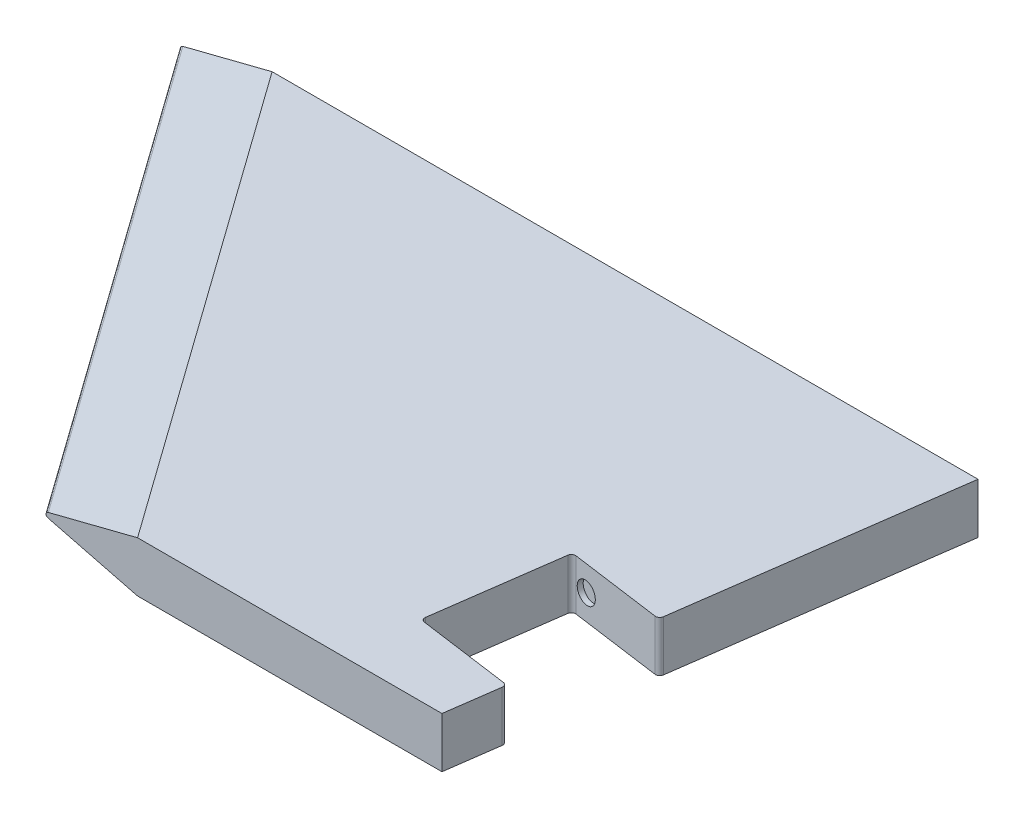
ISO-10303-21;
HEADER;
FILE_DESCRIPTION(('STEP AP214'),'2;1');
FILE_NAME('part.step','',(''),(''),'','','');
FILE_SCHEMA(('AUTOMOTIVE_DESIGN { 1 0 10303 214 1 1 1 1 }'));
ENDSEC;
DATA;
#1=APPLICATION_CONTEXT('core data for automotive mechanical design processes');
#2=APPLICATION_PROTOCOL_DEFINITION('international standard','automotive_design',2000,#1);
#3=PRODUCT_CONTEXT('',#1,'mechanical');
#4=PRODUCT('Part','Part','',(#3));
#5=PRODUCT_RELATED_PRODUCT_CATEGORY('part','',(#4));
#6=PRODUCT_DEFINITION_FORMATION('','',#4);
#7=PRODUCT_DEFINITION_CONTEXT('part definition',#1,'design');
#8=PRODUCT_DEFINITION('design','',#6,#7);
#9=PRODUCT_DEFINITION_SHAPE('','',#8);
#10=(LENGTH_UNIT() NAMED_UNIT(*) SI_UNIT(.MILLI.,.METRE.));
#11=(NAMED_UNIT(*) PLANE_ANGLE_UNIT() SI_UNIT($,.RADIAN.));
#12=(NAMED_UNIT(*) SI_UNIT($,.STERADIAN.) SOLID_ANGLE_UNIT());
#13=UNCERTAINTY_MEASURE_WITH_UNIT(LENGTH_MEASURE(1.E-05),#10,'distance_accuracy_value','');
#14=(GEOMETRIC_REPRESENTATION_CONTEXT(3) GLOBAL_UNCERTAINTY_ASSIGNED_CONTEXT((#13)) GLOBAL_UNIT_ASSIGNED_CONTEXT((#10,
#11,#12)) REPRESENTATION_CONTEXT('',''));
#15=CARTESIAN_POINT('',(0.,0.,0.));
#16=DIRECTION('',(0.,0.,1.));
#17=DIRECTION('',(1.,0.,0.));
#18=AXIS2_PLACEMENT_3D('',#15,#16,#17);
#19=CARTESIAN_POINT('',(0.,9.525,0.));
#20=DIRECTION('',(0.,1.,0.));
#21=DIRECTION('',(0.,0.,1.));
#22=AXIS2_PLACEMENT_3D('',#19,#20,#21);
#23=PLANE('',#22);
#24=DIRECTION('',(-1.,0.,0.));
#25=VECTOR('',#24,1.);
#26=CARTESIAN_POINT('',(-44.1989637892254,9.525,-122.50361009361));
#27=LINE('',#26,#25);
#28=CARTESIAN_POINT('',(107.801036210774,9.525,-122.50361009361));
#29=VERTEX_POINT('',#28);
#30=CARTESIAN_POINT('',(-25.4640970271406,9.525,-122.50361009361));
#31=VERTEX_POINT('',#30);
#32=EDGE_CURVE('E153',#29,#31,#27,.T.);
#33=ORIENTED_EDGE('',*,*,#32,.T.);
#34=DIRECTION('',(-0.581238193719096,0.,-0.813733471206735));
#35=VECTOR('',#34,1.);
#36=CARTESIAN_POINT('',(67.9353624323188,9.525,8.25563314963355));
#37=LINE('',#36,#35);
#38=CARTESIAN_POINT('',(38.0359029728593,9.525,-33.6036100936097));
#39=VERTEX_POINT('',#38);
#40=EDGE_CURVE('E155',#39,#31,#37,.T.);
#41=ORIENTED_EDGE('',*,*,#40,.F.);
#42=DIRECTION('',(1.,0.,0.));
#43=VECTOR('',#42,1.);
#44=CARTESIAN_POINT('',(19.3010362107745,9.525,-33.6036100936097));
#45=LINE('',#44,#43);
#46=CARTESIAN_POINT('',(95.5010362107745,9.525,-33.6036100936097));
#47=VERTEX_POINT('',#46);
#48=EDGE_CURVE('E164',#39,#47,#45,.T.);
#49=ORIENTED_EDGE('',*,*,#48,.T.);
#50=DIRECTION('',(0.137052139146914,0.,-0.990563834972413));
#51=VECTOR('',#50,1.);
#52=CARTESIAN_POINT('',(95.5010362107745,9.525,-33.6036100936097));
#53=LINE('',#52,#51);
#54=CARTESIAN_POINT('',(96.8828312372264,9.525,-43.5907302441439));
#55=VERTEX_POINT('',#54);
#56=EDGE_CURVE('E199',#47,#55,#53,.T.);
#57=ORIENTED_EDGE('',*,*,#56,.T.);
#58=CARTESIAN_POINT('',(96.096571193217,9.525,-43.6995153795918));
#59=DIRECTION('',(0.,1.,0.));
#60=DIRECTION('',(0.,0.,1.));
#61=AXIS2_PLACEMENT_3D('',#58,#59,#60);
#62=CIRCLE('',#61,0.79375);
#63=CARTESIAN_POINT('',(96.2053563286649,9.525,-44.4857754236011));
#64=VERTEX_POINT('',#63);
#65=EDGE_CURVE('E234',#55,#64,#62,.T.);
#66=ORIENTED_EDGE('',*,*,#65,.T.);
#67=DIRECTION('',(0.990563834972414,0.,0.137052139146913));
#68=VECTOR('',#67,1.);
#69=CARTESIAN_POINT('',(96.9916163726742,9.525,-44.3769902881533));
#70=LINE('',#69,#68);
#71=CARTESIAN_POINT('',(78.9076353604591,9.525,-46.8790484034541));
#72=VERTEX_POINT('',#71);
#73=EDGE_CURVE('E307',#72,#64,#70,.T.);
#74=ORIENTED_EDGE('',*,*,#73,.F.);
#75=CARTESIAN_POINT('',(79.016420495907,9.525,-47.6653084474635));
#76=DIRECTION('',(0.,1.,0.));
#77=DIRECTION('',(0.,0.,1.));
#78=AXIS2_PLACEMENT_3D('',#75,#76,#77);
#79=CIRCLE('',#78,0.79375);
#80=CARTESIAN_POINT('',(78.2301604518976,9.525,-47.7740935829113));
#81=VERTEX_POINT('',#80);
#82=EDGE_CURVE('E265',#72,#81,#79,.F.);
#83=ORIENTED_EDGE('',*,*,#82,.T.);
#84=DIRECTION('',(-0.137052139146914,0.,0.990563834972414));
#85=VECTOR('',#84,1.);
#86=CARTESIAN_POINT('',(81.6024996507814,9.525,-72.1481549472013));
#87=LINE('',#86,#85);
#88=CARTESIAN_POINT('',(81.4937145153335,9.525,-71.3618949031919));
#89=VERTEX_POINT('',#88);
#90=EDGE_CURVE('E281',#89,#81,#87,.T.);
#91=ORIENTED_EDGE('',*,*,#90,.F.);
#92=CARTESIAN_POINT('',(82.2799745593429,9.525,-71.2531097677441));
#93=DIRECTION('',(0.,1.,0.));
#94=DIRECTION('',(0.,0.,1.));
#95=AXIS2_PLACEMENT_3D('',#92,#93,#94);
#96=CIRCLE('',#95,0.79375);
#97=CARTESIAN_POINT('',(82.3887596947907,9.525,-72.0393698117534));
#98=VERTEX_POINT('',#97);
#99=EDGE_CURVE('E68',#89,#98,#96,.F.);
#100=ORIENTED_EDGE('',*,*,#99,.T.);
#101=DIRECTION('',(-0.990563834972414,0.,-0.137052139146914));
#102=VECTOR('',#101,1.);
#103=CARTESIAN_POINT('',(81.6024996507814,9.525,-72.1481549472013));
#104=LINE('',#103,#102);
#105=CARTESIAN_POINT('',(99.6864806629965,9.525,-69.6460968319004));
#106=VERTEX_POINT('',#105);
#107=EDGE_CURVE('E314',#106,#98,#104,.T.);
#108=ORIENTED_EDGE('',*,*,#107,.F.);
#109=CARTESIAN_POINT('',(99.7952657984444,9.525,-70.4323568759098));
#110=DIRECTION('',(0.,1.,0.));
#111=DIRECTION('',(0.,0.,1.));
#112=AXIS2_PLACEMENT_3D('',#109,#110,#111);
#113=CIRCLE('',#112,0.79375);
#114=CARTESIAN_POINT('',(100.581525842454,9.525,-70.3235717404619));
#115=VERTEX_POINT('',#114);
#116=EDGE_CURVE('E237',#106,#115,#113,.T.);
#117=ORIENTED_EDGE('',*,*,#116,.T.);
#118=EDGE_CURVE('E158',#115,#29,#53,.T.);
#119=ORIENTED_EDGE('',*,*,#118,.T.);
#120=EDGE_LOOP('',(#33,#41,#49,#57,#66,#74,#83,#91,#100,#108,#117,#119));
#121=FACE_BOUND('',#120,.T.);
#122=ADVANCED_FACE('F52',(#121),#23,.T.);
#123=CARTESIAN_POINT('',(95.5010362107745,9.525,-33.6036100936097));
#124=DIRECTION('',(-0.990563834972414,0.,-0.137052139146914));
#125=DIRECTION('',(-0.137052139146914,0.,0.990563834972414));
#126=AXIS2_PLACEMENT_3D('',#123,#124,#125);
#127=PLANE('',#126);
#128=DIRECTION('',(0.137052139146914,0.,-0.990563834972413));
#129=VECTOR('',#128,1.);
#130=CARTESIAN_POINT('',(95.5010362107745,0.,-33.6036100936097));
#131=LINE('',#130,#129);
#132=CARTESIAN_POINT('',(95.5010362107745,0.,-33.6036100936097));
#133=VERTEX_POINT('',#132);
#134=CARTESIAN_POINT('',(96.8828312372264,0.,-43.5907302441439));
#135=VERTEX_POINT('',#134);
#136=EDGE_CURVE('E165',#133,#135,#131,.T.);
#137=ORIENTED_EDGE('',*,*,#136,.T.);
#138=DIRECTION('',(0.,1.,0.));
#139=VECTOR('',#138,1.);
#140=CARTESIAN_POINT('',(96.8828312372264,9.525,-43.5907302441439));
#141=LINE('',#140,#139);
#142=EDGE_CURVE('E249',#135,#55,#141,.T.);
#143=ORIENTED_EDGE('',*,*,#142,.T.);
#144=ORIENTED_EDGE('',*,*,#56,.F.);
#145=DIRECTION('',(0.,-1.,0.));
#146=VECTOR('',#145,1.);
#147=CARTESIAN_POINT('',(95.5010362107745,9.525,-33.6036100936097));
#148=LINE('',#147,#146);
#149=EDGE_CURVE('E216',#47,#133,#148,.T.);
#150=ORIENTED_EDGE('',*,*,#149,.T.);
#151=EDGE_LOOP('',(#137,#143,#144,#150));
#152=FACE_BOUND('',#151,.T.);
#153=ADVANCED_FACE('F365',(#152),#127,.F.);
#154=CARTESIAN_POINT('',(-44.1989637892254,9.525,-122.50361009361));
#155=DIRECTION('',(0.,0.,1.));
#156=DIRECTION('',(1.,0.,0.));
#157=AXIS2_PLACEMENT_3D('',#154,#155,#156);
#158=PLANE('',#157);
#159=DIRECTION('',(0.969175963988059,-0.246369541193338,0.));
#160=VECTOR('',#159,1.);
#161=CARTESIAN_POINT('',(-44.1989637892254,4.7625,-122.50361009361));
#162=LINE('',#161,#160);
#163=CARTESIAN_POINT('',(-42.3215258296371,4.28524556333464,-122.50361009361));
#164=VERTEX_POINT('',#163);
#165=CARTESIAN_POINT('',(-25.4640970271406,0.,-122.50361009361));
#166=VERTEX_POINT('',#165);
#167=EDGE_CURVE('E171',#164,#166,#162,.T.);
#168=ORIENTED_EDGE('',*,*,#167,.F.);
#169=CARTESIAN_POINT('',(-42.1383070467038,4.7625,-122.50361009361));
#170=DIRECTION('',(0.,0.,1.));
#171=DIRECTION('',(-1.,0.,0.));
#172=AXIS2_PLACEMENT_3D('',#169,#170,#171);
#173=ELLIPSE('',#172,0.614451804788759,0.5);
#174=CARTESIAN_POINT('',(-42.3215258296371,5.23975443666536,-122.50361009361));
#175=VERTEX_POINT('',#174);
#176=EDGE_CURVE('E175',#164,#175,#173,.F.);
#177=ORIENTED_EDGE('',*,*,#176,.T.);
#178=DIRECTION('',(-0.969175963988059,-0.246369541193337,0.));
#179=VECTOR('',#178,1.);
#180=CARTESIAN_POINT('',(-44.1989637892254,4.7625,-122.50361009361));
#181=LINE('',#180,#179);
#182=EDGE_CURVE('E168',#31,#175,#181,.T.);
#183=ORIENTED_EDGE('',*,*,#182,.F.);
#184=ORIENTED_EDGE('',*,*,#32,.F.);
#185=DIRECTION('',(0.,-1.,0.));
#186=VECTOR('',#185,1.);
#187=CARTESIAN_POINT('',(107.801036210774,9.525,-122.50361009361));
#188=LINE('',#187,#186);
#189=CARTESIAN_POINT('',(107.801036210774,0.,-122.50361009361));
#190=VERTEX_POINT('',#189);
#191=EDGE_CURVE('E203',#29,#190,#188,.T.);
#192=ORIENTED_EDGE('',*,*,#191,.T.);
#193=DIRECTION('',(-1.,0.,0.));
#194=VECTOR('',#193,1.);
#195=CARTESIAN_POINT('',(-44.1989637892254,0.,-122.50361009361));
#196=LINE('',#195,#194);
#197=EDGE_CURVE('E195',#190,#166,#196,.T.);
#198=ORIENTED_EDGE('',*,*,#197,.T.);
#199=EDGE_LOOP('',(#168,#177,#183,#184,#192,#198));
#200=FACE_BOUND('',#199,.T.);
#201=ADVANCED_FACE('F174',(#200),#158,.F.);
#202=CARTESIAN_POINT('',(19.3010362107745,9.525,-33.6036100936097));
#203=DIRECTION('',(0.,0.,-1.));
#204=DIRECTION('',(-1.,0.,0.));
#205=AXIS2_PLACEMENT_3D('',#202,#203,#204);
#206=PLANE('',#205);
#207=DIRECTION('',(0.969175963988059,0.246369541193337,0.));
#208=VECTOR('',#207,1.);
#209=CARTESIAN_POINT('',(47.3856597501854,11.901756515938,-33.6036100936097));
#210=LINE('',#209,#208);
#211=CARTESIAN_POINT('',(21.1784741703629,5.23975443666536,-33.6036100936097));
#212=VERTEX_POINT('',#211);
#213=EDGE_CURVE('E169',#212,#39,#210,.T.);
#214=ORIENTED_EDGE('',*,*,#213,.F.);
#215=CARTESIAN_POINT('',(21.3616929532962,4.7625,-33.6036100936097));
#216=DIRECTION('',(0.,0.,-1.));
#217=DIRECTION('',(-1.,0.,0.));
#218=AXIS2_PLACEMENT_3D('',#215,#216,#217);
#219=ELLIPSE('',#218,0.614451804788759,0.5);
#220=CARTESIAN_POINT('',(21.1784741703629,4.28524556333464,-33.6036100936097));
#221=VERTEX_POINT('',#220);
#222=EDGE_CURVE('E11',#212,#221,#219,.F.);
#223=ORIENTED_EDGE('',*,*,#222,.T.);
#224=DIRECTION('',(-0.969175963988059,0.246369541193338,0.));
#225=VECTOR('',#224,1.);
#226=CARTESIAN_POINT('',(41.4404912567415,-0.865463945268253,-33.6036100936097));
#227=LINE('',#226,#225);
#228=CARTESIAN_POINT('',(38.0359029728593,0.,-33.6036100936097));
#229=VERTEX_POINT('',#228);
#230=EDGE_CURVE('E192',#229,#221,#227,.T.);
#231=ORIENTED_EDGE('',*,*,#230,.F.);
#232=DIRECTION('',(1.,0.,0.));
#233=VECTOR('',#232,1.);
#234=CARTESIAN_POINT('',(19.3010362107745,0.,-33.6036100936097));
#235=LINE('',#234,#233);
#236=EDGE_CURVE('E207',#229,#133,#235,.T.);
#237=ORIENTED_EDGE('',*,*,#236,.T.);
#238=ORIENTED_EDGE('',*,*,#149,.F.);
#239=ORIENTED_EDGE('',*,*,#48,.F.);
#240=EDGE_LOOP('',(#214,#223,#231,#237,#238,#239));
#241=FACE_BOUND('',#240,.T.);
#242=ADVANCED_FACE('F369',(#241),#206,.F.);
#243=ORIENTED_EDGE('',*,*,#118,.F.);
#244=DIRECTION('',(0.,1.,0.));
#245=VECTOR('',#244,1.);
#246=CARTESIAN_POINT('',(100.581525842454,9.525,-70.3235717404619));
#247=LINE('',#246,#245);
#248=CARTESIAN_POINT('',(100.581525842454,0.,-70.3235717404619));
#249=VERTEX_POINT('',#248);
#250=EDGE_CURVE('E240',#115,#249,#247,.F.);
#251=ORIENTED_EDGE('',*,*,#250,.T.);
#252=EDGE_CURVE('E210',#249,#190,#131,.T.);
#253=ORIENTED_EDGE('',*,*,#252,.T.);
#254=ORIENTED_EDGE('',*,*,#191,.F.);
#255=EDGE_LOOP('',(#243,#251,#253,#254));
#256=FACE_BOUND('',#255,.T.);
#257=ADVANCED_FACE('F375',(#256),#127,.F.);
#258=CARTESIAN_POINT('',(0.,0.,0.));
#259=DIRECTION('',(0.,1.,0.));
#260=DIRECTION('',(0.,0.,1.));
#261=AXIS2_PLACEMENT_3D('',#258,#259,#260);
#262=PLANE('',#261);
#263=ORIENTED_EDGE('',*,*,#252,.F.);
#264=CARTESIAN_POINT('',(99.7952657984444,0.,-70.4323568759098));
#265=DIRECTION('',(0.,1.,0.));
#266=DIRECTION('',(0.,0.,1.));
#267=AXIS2_PLACEMENT_3D('',#264,#265,#266);
#268=CIRCLE('',#267,0.79375);
#269=CARTESIAN_POINT('',(99.6864806629965,0.,-69.6460968319004));
#270=VERTEX_POINT('',#269);
#271=EDGE_CURVE('E246',#249,#270,#268,.F.);
#272=ORIENTED_EDGE('',*,*,#271,.T.);
#273=DIRECTION('',(-0.990563834972414,0.,-0.137052139146914));
#274=VECTOR('',#273,1.);
#275=CARTESIAN_POINT('',(81.6024996507814,0.,-72.1481549472013));
#276=LINE('',#275,#274);
#277=CARTESIAN_POINT('',(82.3887596947907,0.,-72.0393698117534));
#278=VERTEX_POINT('',#277);
#279=EDGE_CURVE('E300',#270,#278,#276,.T.);
#280=ORIENTED_EDGE('',*,*,#279,.T.);
#281=CARTESIAN_POINT('',(82.2799745593429,0.,-71.2531097677441));
#282=DIRECTION('',(0.,1.,0.));
#283=DIRECTION('',(0.,0.,1.));
#284=AXIS2_PLACEMENT_3D('',#281,#282,#283);
#285=CIRCLE('',#284,0.79375);
#286=CARTESIAN_POINT('',(81.4937145153335,0.,-71.3618949031919));
#287=VERTEX_POINT('',#286);
#288=EDGE_CURVE('E262',#278,#287,#285,.T.);
#289=ORIENTED_EDGE('',*,*,#288,.T.);
#290=DIRECTION('',(-0.137052139146914,0.,0.990563834972414));
#291=VECTOR('',#290,1.);
#292=CARTESIAN_POINT('',(81.6024996507814,0.,-72.1481549472013));
#293=LINE('',#292,#291);
#294=CARTESIAN_POINT('',(78.2301604518976,0.,-47.7740935829113));
#295=VERTEX_POINT('',#294);
#296=EDGE_CURVE('E297',#287,#295,#293,.T.);
#297=ORIENTED_EDGE('',*,*,#296,.T.);
#298=CARTESIAN_POINT('',(79.016420495907,0.,-47.6653084474635));
#299=DIRECTION('',(0.,1.,0.));
#300=DIRECTION('',(0.,0.,1.));
#301=AXIS2_PLACEMENT_3D('',#298,#299,#300);
#302=CIRCLE('',#301,0.79375);
#303=CARTESIAN_POINT('',(78.9076353604591,0.,-46.8790484034541));
#304=VERTEX_POINT('',#303);
#305=EDGE_CURVE('E268',#295,#304,#302,.T.);
#306=ORIENTED_EDGE('',*,*,#305,.T.);
#307=DIRECTION('',(0.990563834972414,0.,0.137052139146913));
#308=VECTOR('',#307,1.);
#309=CARTESIAN_POINT('',(96.9916163726742,0.,-44.3769902881533));
#310=LINE('',#309,#308);
#311=CARTESIAN_POINT('',(96.2053563286649,0.,-44.4857754236011));
#312=VERTEX_POINT('',#311);
#313=EDGE_CURVE('E182',#304,#312,#310,.T.);
#314=ORIENTED_EDGE('',*,*,#313,.T.);
#315=CARTESIAN_POINT('',(96.096571193217,0.,-43.6995153795918));
#316=DIRECTION('',(0.,1.,0.));
#317=DIRECTION('',(0.,0.,1.));
#318=AXIS2_PLACEMENT_3D('',#315,#316,#317);
#319=CIRCLE('',#318,0.79375);
#320=EDGE_CURVE('E243',#312,#135,#319,.F.);
#321=ORIENTED_EDGE('',*,*,#320,.T.);
#322=ORIENTED_EDGE('',*,*,#136,.F.);
#323=ORIENTED_EDGE('',*,*,#236,.F.);
#324=DIRECTION('',(-0.581238193719096,0.,-0.813733471206735));
#325=VECTOR('',#324,1.);
#326=CARTESIAN_POINT('',(61.606015553236,0.,-0.605452481082222));
#327=LINE('',#326,#325);
#328=EDGE_CURVE('E188',#229,#166,#327,.T.);
#329=ORIENTED_EDGE('',*,*,#328,.T.);
#330=ORIENTED_EDGE('',*,*,#197,.F.);
#331=EDGE_LOOP('',(#263,#272,#280,#289,#297,#306,#314,#321,#322,#323,#329,#330));
#332=FACE_BOUND('',#331,.T.);
#333=ADVANCED_FACE('F354',(#332),#262,.F.);
#334=CARTESIAN_POINT('',(42.8711487911513,4.7625,-0.605452481082222));
#335=DIRECTION('',(0.242641090911699,0.954508873330724,-0.173315064936928));
#336=DIRECTION('',(-0.969175963988059,0.246369541193338,0.));
#337=AXIS2_PLACEMENT_3D('',#334,#335,#336);
#338=PLANE('',#337);
#339=ORIENTED_EDGE('',*,*,#230,.T.);
#340=DIRECTION('',(-0.581238193719096,0.,-0.813733471206735));
#341=VECTOR('',#340,1.);
#342=CARTESIAN_POINT('',(44.1143171697976,4.28524556333464,-1.49342989440102));
#343=LINE('',#342,#341);
#344=EDGE_CURVE('E271',#221,#164,#343,.T.);
#345=ORIENTED_EDGE('',*,*,#344,.T.);
#346=ORIENTED_EDGE('',*,*,#167,.T.);
#347=ORIENTED_EDGE('',*,*,#328,.F.);
#348=EDGE_LOOP('',(#339,#345,#346,#347));
#349=FACE_BOUND('',#348,.T.);
#350=ADVANCED_FACE('F401',(#349),#338,.F.);
#351=CARTESIAN_POINT('',(49.200495670234,4.7625,8.25563314963355));
#352=DIRECTION('',(0.242641090911699,-0.954508873330725,-0.173315064936927));
#353=DIRECTION('',(0.96917596398806,0.246369541193337,0.));
#354=AXIS2_PLACEMENT_3D('',#351,#352,#353);
#355=PLANE('',#354);
#356=ORIENTED_EDGE('',*,*,#182,.T.);
#357=DIRECTION('',(-0.581238193719096,0.,-0.813733471206735));
#358=VECTOR('',#357,1.);
#359=CARTESIAN_POINT('',(50.4436640488803,5.23975443666536,7.36765573631475));
#360=LINE('',#359,#358);
#361=EDGE_CURVE('E61',#175,#212,#360,.F.);
#362=ORIENTED_EDGE('',*,*,#361,.T.);
#363=ORIENTED_EDGE('',*,*,#213,.T.);
#364=ORIENTED_EDGE('',*,*,#40,.T.);
#365=EDGE_LOOP('',(#356,#362,#363,#364));
#366=FACE_BOUND('',#365,.T.);
#367=ADVANCED_FACE('F167',(#366),#355,.F.);
#368=CARTESIAN_POINT('',(96.9916163726742,0.,-44.3769902881533));
#369=DIRECTION('',(-0.137052139146913,0.,0.990563834972414));
#370=DIRECTION('',(0.990563834972414,0.,0.137052139146913));
#371=AXIS2_PLACEMENT_3D('',#368,#369,#370);
#372=PLANE('',#371);
#373=ORIENTED_EDGE('',*,*,#73,.T.);
#374=DIRECTION('',(0.,1.,0.));
#375=VECTOR('',#374,1.);
#376=CARTESIAN_POINT('',(96.2053563286649,0.,-44.4857754236011));
#377=LINE('',#376,#375);
#378=EDGE_CURVE('E257',#64,#312,#377,.F.);
#379=ORIENTED_EDGE('',*,*,#378,.T.);
#380=ORIENTED_EDGE('',*,*,#313,.F.);
#381=DIRECTION('',(0.,1.,0.));
#382=VECTOR('',#381,1.);
#383=CARTESIAN_POINT('',(78.9076353604591,9.525,-46.8790484034541));
#384=LINE('',#383,#382);
#385=EDGE_CURVE('E253',#304,#72,#384,.T.);
#386=ORIENTED_EDGE('',*,*,#385,.T.);
#387=EDGE_LOOP('',(#373,#379,#380,#386));
#388=FACE_BOUND('',#387,.T.);
#389=ADVANCED_FACE('F394',(#388),#372,.F.);
#390=CARTESIAN_POINT('',(81.6024996507814,0.,-72.1481549472013));
#391=DIRECTION('',(-0.990563834972414,0.,-0.137052139146914));
#392=DIRECTION('',(-0.137052139146914,0.,0.990563834972414));
#393=AXIS2_PLACEMENT_3D('',#390,#391,#392);
#394=PLANE('',#393);
#395=ORIENTED_EDGE('',*,*,#296,.F.);
#396=DIRECTION('',(0.,1.,0.));
#397=VECTOR('',#396,1.);
#398=CARTESIAN_POINT('',(81.4937145153335,9.525,-71.3618949031919));
#399=LINE('',#398,#397);
#400=EDGE_CURVE('E223',#287,#89,#399,.T.);
#401=ORIENTED_EDGE('',*,*,#400,.T.);
#402=ORIENTED_EDGE('',*,*,#90,.T.);
#403=DIRECTION('',(0.,1.,0.));
#404=VECTOR('',#403,1.);
#405=CARTESIAN_POINT('',(78.2301604518976,0.,-47.7740935829113));
#406=LINE('',#405,#404);
#407=EDGE_CURVE('E220',#81,#295,#406,.F.);
#408=ORIENTED_EDGE('',*,*,#407,.T.);
#409=EDGE_LOOP('',(#395,#401,#402,#408));
#410=FACE_BOUND('',#409,.T.);
#411=ADVANCED_FACE('F390',(#410),#394,.F.);
#412=CARTESIAN_POINT('',(81.6024996507814,0.,-72.1481549472013));
#413=DIRECTION('',(0.137052139146914,0.,-0.990563834972414));
#414=DIRECTION('',(-0.990563834972414,0.,-0.137052139146914));
#415=AXIS2_PLACEMENT_3D('',#412,#413,#414);
#416=PLANE('',#415);
#417=CARTESIAN_POINT('',(84.6176076498116,4.7625,-71.7309915232635));
#418=DIRECTION('',(-0.137052139146914,0.,0.990563834972414));
#419=DIRECTION('',(0.990563834972414,0.,0.137052139146914));
#420=AXIS2_PLACEMENT_3D('',#417,#418,#419);
#421=CIRCLE('',#420,1.99999999999997);
#422=CARTESIAN_POINT('',(86.5987353197564,4.7625,-71.4568872449696));
#423=VERTEX_POINT('',#422);
#424=EDGE_CURVE('E324',#423,#423,#421,.T.);
#425=ORIENTED_EDGE('',*,*,#424,.F.);
#426=EDGE_LOOP('',(#425));
#427=FACE_BOUND('',#426,.T.);
#428=ORIENTED_EDGE('',*,*,#107,.T.);
#429=DIRECTION('',(0.,1.,0.));
#430=VECTOR('',#429,1.);
#431=CARTESIAN_POINT('',(82.3887596947907,0.,-72.0393698117534));
#432=LINE('',#431,#430);
#433=EDGE_CURVE('E231',#98,#278,#432,.F.);
#434=ORIENTED_EDGE('',*,*,#433,.T.);
#435=ORIENTED_EDGE('',*,*,#279,.F.);
#436=DIRECTION('',(0.,1.,0.));
#437=VECTOR('',#436,1.);
#438=CARTESIAN_POINT('',(99.6864806629965,0.,-69.6460968319004));
#439=LINE('',#438,#437);
#440=EDGE_CURVE('E227',#270,#106,#439,.T.);
#441=ORIENTED_EDGE('',*,*,#440,.T.);
#442=EDGE_LOOP('',(#428,#434,#435,#441));
#443=FACE_BOUND('',#442,.T.);
#444=ADVANCED_FACE('F383',(#427,#443),#416,.F.);
#445=CARTESIAN_POINT('',(82.2799745593429,0.,-71.2531097677441));
#446=DIRECTION('',(0.,-1.,0.));
#447=DIRECTION('',(0.,0.,-1.));
#448=AXIS2_PLACEMENT_3D('',#445,#446,#447);
#449=CYLINDRICAL_SURFACE('',#448,0.79375);
#450=ORIENTED_EDGE('',*,*,#433,.F.);
#451=ORIENTED_EDGE('',*,*,#99,.F.);
#452=ORIENTED_EDGE('',*,*,#400,.F.);
#453=ORIENTED_EDGE('',*,*,#288,.F.);
#454=EDGE_LOOP('',(#450,#451,#452,#453));
#455=FACE_BOUND('',#454,.T.);
#456=ADVANCED_FACE('F388',(#455),#449,.F.);
#457=CARTESIAN_POINT('',(99.7952657984444,0.,-70.4323568759098));
#458=DIRECTION('',(0.,1.,0.));
#459=DIRECTION('',(0.,0.,1.));
#460=AXIS2_PLACEMENT_3D('',#457,#458,#459);
#461=CYLINDRICAL_SURFACE('',#460,0.79375);
#462=ORIENTED_EDGE('',*,*,#271,.F.);
#463=ORIENTED_EDGE('',*,*,#250,.F.);
#464=ORIENTED_EDGE('',*,*,#116,.F.);
#465=ORIENTED_EDGE('',*,*,#440,.F.);
#466=EDGE_LOOP('',(#462,#463,#464,#465));
#467=FACE_BOUND('',#466,.T.);
#468=ADVANCED_FACE('F381',(#467),#461,.T.);
#469=CARTESIAN_POINT('',(96.096571193217,9.525,-43.6995153795918));
#470=DIRECTION('',(0.,1.,0.));
#471=DIRECTION('',(0.,0.,1.));
#472=AXIS2_PLACEMENT_3D('',#469,#470,#471);
#473=CYLINDRICAL_SURFACE('',#472,0.79375);
#474=ORIENTED_EDGE('',*,*,#320,.F.);
#475=ORIENTED_EDGE('',*,*,#378,.F.);
#476=ORIENTED_EDGE('',*,*,#65,.F.);
#477=ORIENTED_EDGE('',*,*,#142,.F.);
#478=EDGE_LOOP('',(#474,#475,#476,#477));
#479=FACE_BOUND('',#478,.T.);
#480=ADVANCED_FACE('F362',(#479),#473,.T.);
#481=CARTESIAN_POINT('',(79.016420495907,0.,-47.6653084474635));
#482=DIRECTION('',(0.,-1.,0.));
#483=DIRECTION('',(0.,0.,-1.));
#484=AXIS2_PLACEMENT_3D('',#481,#482,#483);
#485=CYLINDRICAL_SURFACE('',#484,0.79375);
#486=ORIENTED_EDGE('',*,*,#305,.F.);
#487=ORIENTED_EDGE('',*,*,#407,.F.);
#488=ORIENTED_EDGE('',*,*,#82,.F.);
#489=ORIENTED_EDGE('',*,*,#385,.F.);
#490=EDGE_LOOP('',(#486,#487,#488,#489));
#491=FACE_BOUND('',#490,.T.);
#492=ADVANCED_FACE('F393',(#491),#485,.F.);
#493=CARTESIAN_POINT('',(44.2356377152534,4.7625,-1.58008742686949));
#494=DIRECTION('',(-0.581238193719096,0.,-0.813733471206735));
#495=DIRECTION('',(-0.813733471206735,0.,0.581238193719096));
#496=AXIS2_PLACEMENT_3D('',#493,#494,#495);
#497=CYLINDRICAL_SURFACE('',#496,0.5);
#498=ORIENTED_EDGE('',*,*,#222,.F.);
#499=ORIENTED_EDGE('',*,*,#361,.F.);
#500=ORIENTED_EDGE('',*,*,#176,.F.);
#501=ORIENTED_EDGE('',*,*,#344,.F.);
#502=EDGE_LOOP('',(#498,#499,#500,#501));
#503=FACE_BOUND('',#502,.T.);
#504=ADVANCED_FACE('F54',(#503),#497,.T.);
#505=CARTESIAN_POINT('',(84.7546597889585,4.7625,-72.7215553582359));
#506=DIRECTION('',(-0.137052139146914,0.,0.990563834972414));
#507=DIRECTION('',(0.990563834972414,0.,0.137052139146914));
#508=AXIS2_PLACEMENT_3D('',#505,#506,#507);
#509=CYLINDRICAL_SURFACE('',#508,1.99999999999997);
#510=CARTESIAN_POINT('',(84.7546597889585,4.7625,-72.7215553582359));
#511=DIRECTION('',(-0.137052139146914,0.,0.990563834972414));
#512=DIRECTION('',(0.990563834972414,0.,0.137052139146914));
#513=AXIS2_PLACEMENT_3D('',#510,#511,#512);
#514=CIRCLE('',#513,1.99999999999997);
#515=CARTESIAN_POINT('',(86.7357874589033,4.7625,-72.447451079942));
#516=VERTEX_POINT('',#515);
#517=EDGE_CURVE('E319',#516,#516,#514,.T.);
#518=ORIENTED_EDGE('',*,*,#517,.F.);
#519=EDGE_LOOP('',(#518));
#520=FACE_BOUND('',#519,.T.);
#521=ORIENTED_EDGE('',*,*,#424,.T.);
#522=EDGE_LOOP('',(#521));
#523=FACE_BOUND('',#522,.T.);
#524=ADVANCED_FACE('F426',(#520,#523),#509,.F.);
#525=CARTESIAN_POINT('',(84.7546597889585,4.7625,-72.7215553582359));
#526=DIRECTION('',(-0.137052139146914,0.,0.990563834972414));
#527=DIRECTION('',(0.990563834972414,0.,0.137052139146914));
#528=AXIS2_PLACEMENT_3D('',#525,#526,#527);
#529=PLANE('',#528);
#530=ORIENTED_EDGE('',*,*,#517,.T.);
#531=EDGE_LOOP('',(#530));
#532=FACE_BOUND('',#531,.T.);
#533=ADVANCED_FACE('F430',(#532),#529,.T.);
#534=CLOSED_SHELL('',(#122,#153,#201,#242,#257,#333,#350,#367,#389,#411,#444,#456,#468,#480,
#492,#504,#524,#533));
#535=MANIFOLD_SOLID_BREP('B2',#534);
#536=ADVANCED_BREP_SHAPE_REPRESENTATION('',(#18,#535),#14);
#537=SHAPE_DEFINITION_REPRESENTATION(#9,#536);
ENDSEC;
END-ISO-10303-21;
